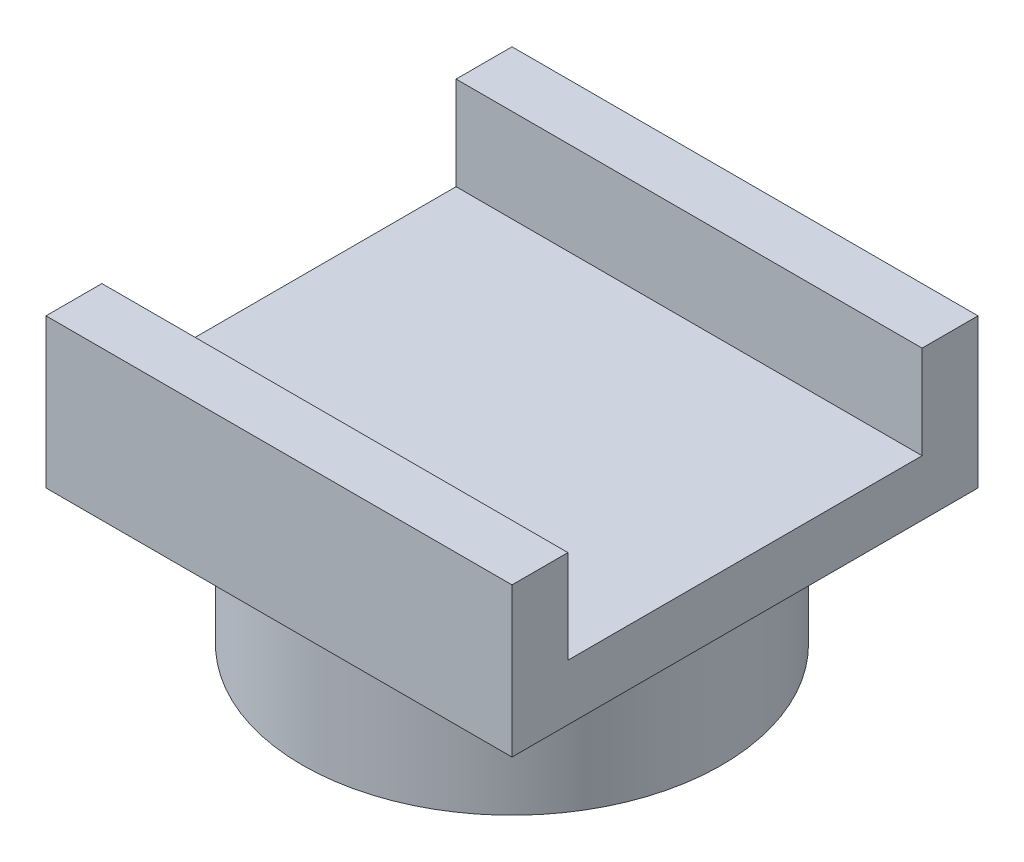
ISO-10303-21;
HEADER;
FILE_DESCRIPTION(('STEP AP214'),'2;1');
FILE_NAME('part.step','',(''),(''),'','','');
FILE_SCHEMA(('AUTOMOTIVE_DESIGN { 1 0 10303 214 1 1 1 1 }'));
ENDSEC;
DATA;
#1=APPLICATION_CONTEXT('core data for automotive mechanical design processes');
#2=APPLICATION_PROTOCOL_DEFINITION('international standard','automotive_design',2000,#1);
#3=PRODUCT_CONTEXT('',#1,'mechanical');
#4=PRODUCT('Part','Part','',(#3));
#5=PRODUCT_RELATED_PRODUCT_CATEGORY('part','',(#4));
#6=PRODUCT_DEFINITION_FORMATION('','',#4);
#7=PRODUCT_DEFINITION_CONTEXT('part definition',#1,'design');
#8=PRODUCT_DEFINITION('design','',#6,#7);
#9=PRODUCT_DEFINITION_SHAPE('','',#8);
#10=(LENGTH_UNIT() NAMED_UNIT(*) SI_UNIT(.MILLI.,.METRE.));
#11=(NAMED_UNIT(*) PLANE_ANGLE_UNIT() SI_UNIT($,.RADIAN.));
#12=(NAMED_UNIT(*) SI_UNIT($,.STERADIAN.) SOLID_ANGLE_UNIT());
#13=UNCERTAINTY_MEASURE_WITH_UNIT(LENGTH_MEASURE(1.E-05),#10,'distance_accuracy_value','');
#14=(GEOMETRIC_REPRESENTATION_CONTEXT(3) GLOBAL_UNCERTAINTY_ASSIGNED_CONTEXT((#13)) GLOBAL_UNIT_ASSIGNED_CONTEXT((#10,
#11,#12)) REPRESENTATION_CONTEXT('',''));
#15=CARTESIAN_POINT('',(0.,0.,0.));
#16=DIRECTION('',(0.,0.,1.));
#17=DIRECTION('',(1.,0.,0.));
#18=AXIS2_PLACEMENT_3D('',#15,#16,#17);
#19=CARTESIAN_POINT('',(0.,4.1,0.));
#20=DIRECTION('',(0.,-1.,0.));
#21=DIRECTION('',(0.,0.,-1.));
#22=AXIS2_PLACEMENT_3D('',#19,#20,#21);
#23=PLANE('',#22);
#24=DIRECTION('',(-1.,0.,0.));
#25=VECTOR('',#24,1.);
#26=CARTESIAN_POINT('',(-5.,4.1,3.8));
#27=LINE('',#26,#25);
#28=CARTESIAN_POINT('',(5.,4.1,3.8));
#29=VERTEX_POINT('',#28);
#30=CARTESIAN_POINT('',(-5.,4.1,3.8));
#31=VERTEX_POINT('',#30);
#32=EDGE_CURVE('E48',#29,#31,#27,.T.);
#33=ORIENTED_EDGE('',*,*,#32,.F.);
#34=DIRECTION('',(0.,0.,-1.));
#35=VECTOR('',#34,1.);
#36=CARTESIAN_POINT('',(5.,4.1,5.));
#37=LINE('',#36,#35);
#38=CARTESIAN_POINT('',(5.,4.1,-3.8));
#39=VERTEX_POINT('',#38);
#40=EDGE_CURVE('E153',#29,#39,#37,.T.);
#41=ORIENTED_EDGE('',*,*,#40,.T.);
#42=DIRECTION('',(1.,0.,0.));
#43=VECTOR('',#42,1.);
#44=CARTESIAN_POINT('',(-5.,4.1,-3.8));
#45=LINE('',#44,#43);
#46=CARTESIAN_POINT('',(-5.,4.1,-3.8));
#47=VERTEX_POINT('',#46);
#48=EDGE_CURVE('E132',#47,#39,#45,.T.);
#49=ORIENTED_EDGE('',*,*,#48,.F.);
#50=DIRECTION('',(0.,0.,1.));
#51=VECTOR('',#50,1.);
#52=CARTESIAN_POINT('',(-5.,4.1,5.));
#53=LINE('',#52,#51);
#54=EDGE_CURVE('E53',#47,#31,#53,.T.);
#55=ORIENTED_EDGE('',*,*,#54,.T.);
#56=EDGE_LOOP('',(#33,#41,#49,#55));
#57=FACE_BOUND('',#56,.T.);
#58=ADVANCED_FACE('F33',(#57),#23,.F.);
#59=CARTESIAN_POINT('',(0.,2.9,0.));
#60=DIRECTION('',(0.,-1.,0.));
#61=DIRECTION('',(0.,0.,-1.));
#62=AXIS2_PLACEMENT_3D('',#59,#60,#61);
#63=CYLINDRICAL_SURFACE('',#62,4.5);
#64=CARTESIAN_POINT('',(0.,2.9,0.));
#65=DIRECTION('',(0.,1.,0.));
#66=DIRECTION('',(0.,0.,1.));
#67=AXIS2_PLACEMENT_3D('',#64,#65,#66);
#68=CIRCLE('',#67,4.5);
#69=CARTESIAN_POINT('',(0.,2.9,4.5));
#70=VERTEX_POINT('',#69);
#71=EDGE_CURVE('E11',#70,#70,#68,.T.);
#72=ORIENTED_EDGE('',*,*,#71,.F.);
#73=EDGE_LOOP('',(#72));
#74=FACE_BOUND('',#73,.T.);
#75=CARTESIAN_POINT('',(0.,0.,0.));
#76=DIRECTION('',(0.,1.,0.));
#77=DIRECTION('',(0.,0.,1.));
#78=AXIS2_PLACEMENT_3D('',#75,#76,#77);
#79=CIRCLE('',#78,4.5);
#80=CARTESIAN_POINT('',(0.,0.,4.5));
#81=VERTEX_POINT('',#80);
#82=EDGE_CURVE('E37',#81,#81,#79,.T.);
#83=ORIENTED_EDGE('',*,*,#82,.T.);
#84=EDGE_LOOP('',(#83));
#85=FACE_BOUND('',#84,.T.);
#86=ADVANCED_FACE('F35',(#74,#85),#63,.T.);
#87=CARTESIAN_POINT('',(0.,0.,0.));
#88=DIRECTION('',(0.,1.,0.));
#89=DIRECTION('',(0.,0.,1.));
#90=AXIS2_PLACEMENT_3D('',#87,#88,#89);
#91=PLANE('',#90);
#92=ORIENTED_EDGE('',*,*,#82,.F.);
#93=EDGE_LOOP('',(#92));
#94=FACE_BOUND('',#93,.T.);
#95=ADVANCED_FACE('F173',(#94),#91,.F.);
#96=CARTESIAN_POINT('',(5.,4.1,5.));
#97=DIRECTION('',(-1.,0.,0.));
#98=DIRECTION('',(0.,0.,1.));
#99=AXIS2_PLACEMENT_3D('',#96,#97,#98);
#100=PLANE('',#99);
#101=DIRECTION('',(0.,0.,-1.));
#102=VECTOR('',#101,1.);
#103=CARTESIAN_POINT('',(5.,2.9,5.));
#104=LINE('',#103,#102);
#105=CARTESIAN_POINT('',(5.,2.9,5.));
#106=VERTEX_POINT('',#105);
#107=CARTESIAN_POINT('',(5.,2.9,-5.));
#108=VERTEX_POINT('',#107);
#109=EDGE_CURVE('E152',#106,#108,#104,.T.);
#110=ORIENTED_EDGE('',*,*,#109,.T.);
#111=DIRECTION('',(0.,-1.,0.));
#112=VECTOR('',#111,1.);
#113=CARTESIAN_POINT('',(5.,4.1,-5.));
#114=LINE('',#113,#112);
#115=CARTESIAN_POINT('',(5.,6.1,-5.));
#116=VERTEX_POINT('',#115);
#117=EDGE_CURVE('E165',#116,#108,#114,.T.);
#118=ORIENTED_EDGE('',*,*,#117,.F.);
#119=DIRECTION('',(0.,0.,-1.));
#120=VECTOR('',#119,1.);
#121=CARTESIAN_POINT('',(5.,6.1,-5.));
#122=LINE('',#121,#120);
#123=CARTESIAN_POINT('',(5.,6.1,-3.8));
#124=VERTEX_POINT('',#123);
#125=EDGE_CURVE('E138',#124,#116,#122,.T.);
#126=ORIENTED_EDGE('',*,*,#125,.F.);
#127=DIRECTION('',(0.,-1.,0.));
#128=VECTOR('',#127,1.);
#129=CARTESIAN_POINT('',(5.,6.1,-3.8));
#130=LINE('',#129,#128);
#131=EDGE_CURVE('E144',#124,#39,#130,.T.);
#132=ORIENTED_EDGE('',*,*,#131,.T.);
#133=ORIENTED_EDGE('',*,*,#40,.F.);
#134=DIRECTION('',(0.,-1.,0.));
#135=VECTOR('',#134,1.);
#136=CARTESIAN_POINT('',(5.,6.1,3.8));
#137=LINE('',#136,#135);
#138=CARTESIAN_POINT('',(5.,6.1,3.8));
#139=VERTEX_POINT('',#138);
#140=EDGE_CURVE('E129',#139,#29,#137,.T.);
#141=ORIENTED_EDGE('',*,*,#140,.F.);
#142=DIRECTION('',(0.,0.,-1.));
#143=VECTOR('',#142,1.);
#144=CARTESIAN_POINT('',(5.,6.1,5.));
#145=LINE('',#144,#143);
#146=CARTESIAN_POINT('',(5.,6.1,5.));
#147=VERTEX_POINT('',#146);
#148=EDGE_CURVE('E116',#147,#139,#145,.T.);
#149=ORIENTED_EDGE('',*,*,#148,.F.);
#150=DIRECTION('',(0.,-1.,0.));
#151=VECTOR('',#150,1.);
#152=CARTESIAN_POINT('',(5.,4.1,5.));
#153=LINE('',#152,#151);
#154=EDGE_CURVE('E108',#147,#106,#153,.T.);
#155=ORIENTED_EDGE('',*,*,#154,.T.);
#156=EDGE_LOOP('',(#110,#118,#126,#132,#133,#141,#149,#155));
#157=FACE_BOUND('',#156,.T.);
#158=ADVANCED_FACE('F175',(#157),#100,.F.);
#159=CARTESIAN_POINT('',(-5.,4.1,-5.));
#160=DIRECTION('',(0.,0.,1.));
#161=DIRECTION('',(1.,0.,0.));
#162=AXIS2_PLACEMENT_3D('',#159,#160,#161);
#163=PLANE('',#162);
#164=DIRECTION('',(-1.,0.,0.));
#165=VECTOR('',#164,1.);
#166=CARTESIAN_POINT('',(-5.,2.9,-5.));
#167=LINE('',#166,#165);
#168=CARTESIAN_POINT('',(-5.,2.9,-5.));
#169=VERTEX_POINT('',#168);
#170=EDGE_CURVE('E159',#108,#169,#167,.T.);
#171=ORIENTED_EDGE('',*,*,#170,.T.);
#172=DIRECTION('',(0.,-1.,0.));
#173=VECTOR('',#172,1.);
#174=CARTESIAN_POINT('',(-5.,4.1,-5.));
#175=LINE('',#174,#173);
#176=CARTESIAN_POINT('',(-5.,6.1,-5.));
#177=VERTEX_POINT('',#176);
#178=EDGE_CURVE('E107',#177,#169,#175,.T.);
#179=ORIENTED_EDGE('',*,*,#178,.F.);
#180=DIRECTION('',(-1.,0.,0.));
#181=VECTOR('',#180,1.);
#182=CARTESIAN_POINT('',(-5.,6.1,-5.));
#183=LINE('',#182,#181);
#184=EDGE_CURVE('E141',#116,#177,#183,.T.);
#185=ORIENTED_EDGE('',*,*,#184,.F.);
#186=ORIENTED_EDGE('',*,*,#117,.T.);
#187=EDGE_LOOP('',(#171,#179,#185,#186));
#188=FACE_BOUND('',#187,.T.);
#189=ADVANCED_FACE('F180',(#188),#163,.F.);
#190=CARTESIAN_POINT('',(-5.,4.1,5.));
#191=DIRECTION('',(1.,0.,0.));
#192=DIRECTION('',(0.,0.,-1.));
#193=AXIS2_PLACEMENT_3D('',#190,#191,#192);
#194=PLANE('',#193);
#195=DIRECTION('',(0.,0.,1.));
#196=VECTOR('',#195,1.);
#197=CARTESIAN_POINT('',(-5.,2.9,5.));
#198=LINE('',#197,#196);
#199=CARTESIAN_POINT('',(-5.,2.9,5.));
#200=VERTEX_POINT('',#199);
#201=EDGE_CURVE('E104',#169,#200,#198,.T.);
#202=ORIENTED_EDGE('',*,*,#201,.T.);
#203=DIRECTION('',(0.,-1.,0.));
#204=VECTOR('',#203,1.);
#205=CARTESIAN_POINT('',(-5.,4.1,5.));
#206=LINE('',#205,#204);
#207=CARTESIAN_POINT('',(-5.,6.1,5.));
#208=VERTEX_POINT('',#207);
#209=EDGE_CURVE('E96',#208,#200,#206,.T.);
#210=ORIENTED_EDGE('',*,*,#209,.F.);
#211=DIRECTION('',(0.,0.,1.));
#212=VECTOR('',#211,1.);
#213=CARTESIAN_POINT('',(-5.,6.1,5.));
#214=LINE('',#213,#212);
#215=CARTESIAN_POINT('',(-5.,6.1,3.8));
#216=VERTEX_POINT('',#215);
#217=EDGE_CURVE('E101',#216,#208,#214,.T.);
#218=ORIENTED_EDGE('',*,*,#217,.F.);
#219=DIRECTION('',(0.,-1.,0.));
#220=VECTOR('',#219,1.);
#221=CARTESIAN_POINT('',(-5.,6.1,3.8));
#222=LINE('',#221,#220);
#223=EDGE_CURVE('E126',#216,#31,#222,.T.);
#224=ORIENTED_EDGE('',*,*,#223,.T.);
#225=ORIENTED_EDGE('',*,*,#54,.F.);
#226=DIRECTION('',(0.,-1.,0.));
#227=VECTOR('',#226,1.);
#228=CARTESIAN_POINT('',(-5.,6.1,-3.8));
#229=LINE('',#228,#227);
#230=CARTESIAN_POINT('',(-5.,6.1,-3.8));
#231=VERTEX_POINT('',#230);
#232=EDGE_CURVE('E149',#231,#47,#229,.T.);
#233=ORIENTED_EDGE('',*,*,#232,.F.);
#234=DIRECTION('',(0.,0.,1.));
#235=VECTOR('',#234,1.);
#236=CARTESIAN_POINT('',(-5.,6.1,-5.));
#237=LINE('',#236,#235);
#238=EDGE_CURVE('E133',#177,#231,#237,.T.);
#239=ORIENTED_EDGE('',*,*,#238,.F.);
#240=ORIENTED_EDGE('',*,*,#178,.T.);
#241=EDGE_LOOP('',(#202,#210,#218,#224,#225,#233,#239,#240));
#242=FACE_BOUND('',#241,.T.);
#243=ADVANCED_FACE('F98',(#242),#194,.F.);
#244=CARTESIAN_POINT('',(-5.,4.1,5.));
#245=DIRECTION('',(0.,0.,-1.));
#246=DIRECTION('',(-1.,0.,0.));
#247=AXIS2_PLACEMENT_3D('',#244,#245,#246);
#248=PLANE('',#247);
#249=DIRECTION('',(1.,0.,0.));
#250=VECTOR('',#249,1.);
#251=CARTESIAN_POINT('',(-5.,2.9,5.));
#252=LINE('',#251,#250);
#253=EDGE_CURVE('E155',#200,#106,#252,.T.);
#254=ORIENTED_EDGE('',*,*,#253,.T.);
#255=ORIENTED_EDGE('',*,*,#154,.F.);
#256=DIRECTION('',(1.,0.,0.));
#257=VECTOR('',#256,1.);
#258=CARTESIAN_POINT('',(-5.,6.1,5.));
#259=LINE('',#258,#257);
#260=EDGE_CURVE('E111',#208,#147,#259,.T.);
#261=ORIENTED_EDGE('',*,*,#260,.F.);
#262=ORIENTED_EDGE('',*,*,#209,.T.);
#263=EDGE_LOOP('',(#254,#255,#261,#262));
#264=FACE_BOUND('',#263,.T.);
#265=ADVANCED_FACE('F112',(#264),#248,.F.);
#266=CARTESIAN_POINT('',(0.,2.9,0.));
#267=DIRECTION('',(0.,-1.,0.));
#268=DIRECTION('',(0.,0.,-1.));
#269=AXIS2_PLACEMENT_3D('',#266,#267,#268);
#270=PLANE('',#269);
#271=ORIENTED_EDGE('',*,*,#71,.T.);
#272=EDGE_LOOP('',(#271));
#273=FACE_BOUND('',#272,.T.);
#274=ORIENTED_EDGE('',*,*,#109,.F.);
#275=ORIENTED_EDGE('',*,*,#253,.F.);
#276=ORIENTED_EDGE('',*,*,#201,.F.);
#277=ORIENTED_EDGE('',*,*,#170,.F.);
#278=EDGE_LOOP('',(#274,#275,#276,#277));
#279=FACE_BOUND('',#278,.T.);
#280=ADVANCED_FACE('F192',(#273,#279),#270,.T.);
#281=CARTESIAN_POINT('',(-5.,6.1,-3.8));
#282=DIRECTION('',(0.,0.,-1.));
#283=DIRECTION('',(-1.,0.,0.));
#284=AXIS2_PLACEMENT_3D('',#281,#282,#283);
#285=PLANE('',#284);
#286=ORIENTED_EDGE('',*,*,#48,.T.);
#287=ORIENTED_EDGE('',*,*,#131,.F.);
#288=DIRECTION('',(1.,0.,0.));
#289=VECTOR('',#288,1.);
#290=CARTESIAN_POINT('',(-5.,6.1,-3.8));
#291=LINE('',#290,#289);
#292=EDGE_CURVE('E136',#231,#124,#291,.T.);
#293=ORIENTED_EDGE('',*,*,#292,.F.);
#294=ORIENTED_EDGE('',*,*,#232,.T.);
#295=EDGE_LOOP('',(#286,#287,#293,#294));
#296=FACE_BOUND('',#295,.T.);
#297=ADVANCED_FACE('F190',(#296),#285,.F.);
#298=CARTESIAN_POINT('',(0.,6.1,0.));
#299=DIRECTION('',(0.,1.,0.));
#300=DIRECTION('',(0.,0.,1.));
#301=AXIS2_PLACEMENT_3D('',#298,#299,#300);
#302=PLANE('',#301);
#303=ORIENTED_EDGE('',*,*,#238,.T.);
#304=ORIENTED_EDGE('',*,*,#292,.T.);
#305=ORIENTED_EDGE('',*,*,#125,.T.);
#306=ORIENTED_EDGE('',*,*,#184,.T.);
#307=EDGE_LOOP('',(#303,#304,#305,#306));
#308=FACE_BOUND('',#307,.T.);
#309=ADVANCED_FACE('F214',(#308),#302,.T.);
#310=CARTESIAN_POINT('',(-5.,6.1,3.8));
#311=DIRECTION('',(0.,0.,1.));
#312=DIRECTION('',(1.,0.,0.));
#313=AXIS2_PLACEMENT_3D('',#310,#311,#312);
#314=PLANE('',#313);
#315=ORIENTED_EDGE('',*,*,#32,.T.);
#316=ORIENTED_EDGE('',*,*,#223,.F.);
#317=DIRECTION('',(-1.,0.,0.));
#318=VECTOR('',#317,1.);
#319=CARTESIAN_POINT('',(-5.,6.1,3.8));
#320=LINE('',#319,#318);
#321=EDGE_CURVE('E120',#139,#216,#320,.T.);
#322=ORIENTED_EDGE('',*,*,#321,.F.);
#323=ORIENTED_EDGE('',*,*,#140,.T.);
#324=EDGE_LOOP('',(#315,#316,#322,#323));
#325=FACE_BOUND('',#324,.T.);
#326=ADVANCED_FACE('F209',(#325),#314,.F.);
#327=CARTESIAN_POINT('',(0.,6.1,0.));
#328=DIRECTION('',(0.,-1.,0.));
#329=DIRECTION('',(0.,0.,-1.));
#330=AXIS2_PLACEMENT_3D('',#327,#328,#329);
#331=PLANE('',#330);
#332=ORIENTED_EDGE('',*,*,#217,.T.);
#333=ORIENTED_EDGE('',*,*,#260,.T.);
#334=ORIENTED_EDGE('',*,*,#148,.T.);
#335=ORIENTED_EDGE('',*,*,#321,.T.);
#336=EDGE_LOOP('',(#332,#333,#334,#335));
#337=FACE_BOUND('',#336,.T.);
#338=ADVANCED_FACE('F118',(#337),#331,.F.);
#339=CLOSED_SHELL('',(#58,#86,#95,#158,#189,#243,#265,#280,#297,#309,#326,#338));
#340=MANIFOLD_SOLID_BREP('B2',#339);
#341=ADVANCED_BREP_SHAPE_REPRESENTATION('',(#18,#340),#14);
#342=SHAPE_DEFINITION_REPRESENTATION(#9,#341);
ENDSEC;
END-ISO-10303-21;
